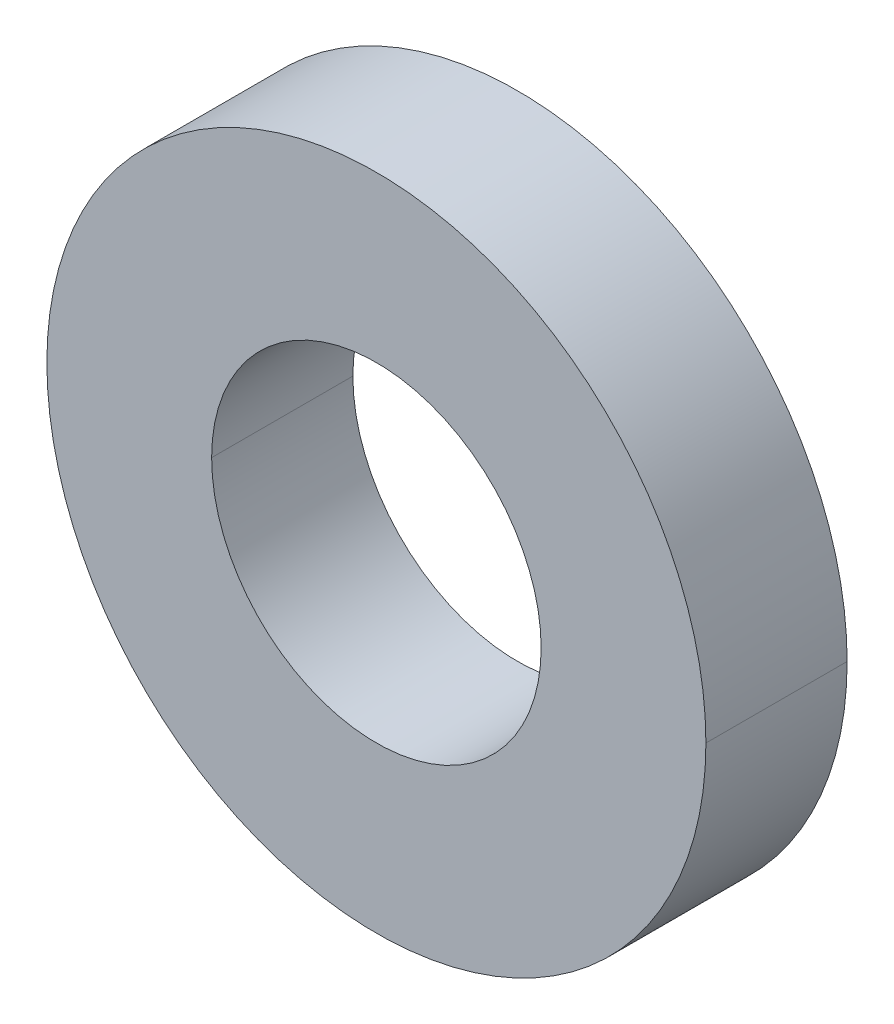
ISO-10303-21;
HEADER;
FILE_DESCRIPTION(('STEP AP214'),'2;1');
FILE_NAME('part.step','',(''),(''),'','','');
FILE_SCHEMA(('AUTOMOTIVE_DESIGN { 1 0 10303 214 1 1 1 1 }'));
ENDSEC;
DATA;
#1=APPLICATION_CONTEXT('core data for automotive mechanical design processes');
#2=APPLICATION_PROTOCOL_DEFINITION('international standard','automotive_design',2000,#1);
#3=PRODUCT_CONTEXT('',#1,'mechanical');
#4=PRODUCT('Part','Part','',(#3));
#5=PRODUCT_RELATED_PRODUCT_CATEGORY('part','',(#4));
#6=PRODUCT_DEFINITION_FORMATION('','',#4);
#7=PRODUCT_DEFINITION_CONTEXT('part definition',#1,'design');
#8=PRODUCT_DEFINITION('design','',#6,#7);
#9=PRODUCT_DEFINITION_SHAPE('','',#8);
#10=(LENGTH_UNIT() NAMED_UNIT(*) SI_UNIT(.MILLI.,.METRE.));
#11=(NAMED_UNIT(*) PLANE_ANGLE_UNIT() SI_UNIT($,.RADIAN.));
#12=(NAMED_UNIT(*) SI_UNIT($,.STERADIAN.) SOLID_ANGLE_UNIT());
#13=UNCERTAINTY_MEASURE_WITH_UNIT(LENGTH_MEASURE(1.E-05),#10,'distance_accuracy_value','');
#14=(GEOMETRIC_REPRESENTATION_CONTEXT(3) GLOBAL_UNCERTAINTY_ASSIGNED_CONTEXT((#13)) GLOBAL_UNIT_ASSIGNED_CONTEXT((#10,
#11,#12)) REPRESENTATION_CONTEXT('',''));
#15=CARTESIAN_POINT('',(0.,0.,0.));
#16=DIRECTION('',(0.,0.,1.));
#17=DIRECTION('',(1.,0.,0.));
#18=AXIS2_PLACEMENT_3D('',#15,#16,#17);
#19=CARTESIAN_POINT('',(0.,0.,0.));
#20=DIRECTION('',(0.,0.,1.));
#21=DIRECTION('',(1.,0.,0.));
#22=AXIS2_PLACEMENT_3D('',#19,#20,#21);
#23=PLANE('',#22);
#24=CARTESIAN_POINT('',(0.,0.,0.));
#25=DIRECTION('',(0.,0.,-1.));
#26=DIRECTION('',(-1.,0.,0.));
#27=AXIS2_PLACEMENT_3D('',#24,#25,#26);
#28=CIRCLE('',#27,3.5);
#29=CARTESIAN_POINT('',(3.5,0.,0.));
#30=VERTEX_POINT('',#29);
#31=CARTESIAN_POINT('',(-3.5,0.,0.));
#32=VERTEX_POINT('',#31);
#33=EDGE_CURVE('E82',#30,#32,#28,.F.);
#34=ORIENTED_EDGE('',*,*,#33,.T.);
#35=CARTESIAN_POINT('',(0.,0.,0.));
#36=DIRECTION('',(0.,0.,-1.));
#37=DIRECTION('',(-1.,0.,0.));
#38=AXIS2_PLACEMENT_3D('',#35,#36,#37);
#39=CIRCLE('',#38,3.5);
#40=EDGE_CURVE('E79',#32,#30,#39,.F.);
#41=ORIENTED_EDGE('',*,*,#40,.T.);
#42=EDGE_LOOP('',(#34,#41));
#43=FACE_BOUND('',#42,.T.);
#44=CARTESIAN_POINT('',(0.,0.,0.));
#45=DIRECTION('',(0.,0.,-1.));
#46=DIRECTION('',(-1.,0.,0.));
#47=AXIS2_PLACEMENT_3D('',#44,#45,#46);
#48=CIRCLE('',#47,7.);
#49=CARTESIAN_POINT('',(-7.,0.,0.));
#50=VERTEX_POINT('',#49);
#51=CARTESIAN_POINT('',(7.,0.,0.));
#52=VERTEX_POINT('',#51);
#53=EDGE_CURVE('E20',#50,#52,#48,.F.);
#54=ORIENTED_EDGE('',*,*,#53,.F.);
#55=CARTESIAN_POINT('',(0.,0.,0.));
#56=DIRECTION('',(0.,0.,-1.));
#57=DIRECTION('',(-1.,0.,0.));
#58=AXIS2_PLACEMENT_3D('',#55,#56,#57);
#59=CIRCLE('',#58,7.);
#60=EDGE_CURVE('E64',#52,#50,#59,.F.);
#61=ORIENTED_EDGE('',*,*,#60,.F.);
#62=EDGE_LOOP('',(#54,#61));
#63=FACE_BOUND('',#62,.T.);
#64=ADVANCED_FACE('F17',(#43,#63),#23,.F.);
#65=CARTESIAN_POINT('',(0.,0.,3.));
#66=DIRECTION('',(0.,0.,-1.));
#67=DIRECTION('',(-1.,0.,0.));
#68=AXIS2_PLACEMENT_3D('',#65,#66,#67);
#69=CYLINDRICAL_SURFACE('',#68,7.);
#70=DIRECTION('',(0.,0.,-1.));
#71=VECTOR('',#70,1.);
#72=CARTESIAN_POINT('',(7.,0.,3.));
#73=LINE('',#72,#71);
#74=CARTESIAN_POINT('',(7.,0.,3.));
#75=VERTEX_POINT('',#74);
#76=EDGE_CURVE('E59',#75,#52,#73,.T.);
#77=ORIENTED_EDGE('',*,*,#76,.F.);
#78=CARTESIAN_POINT('',(0.,0.,3.));
#79=DIRECTION('',(0.,0.,-1.));
#80=DIRECTION('',(-1.,0.,0.));
#81=AXIS2_PLACEMENT_3D('',#78,#79,#80);
#82=CIRCLE('',#81,7.);
#83=CARTESIAN_POINT('',(-7.,0.,3.));
#84=VERTEX_POINT('',#83);
#85=EDGE_CURVE('E77',#84,#75,#82,.F.);
#86=ORIENTED_EDGE('',*,*,#85,.F.);
#87=DIRECTION('',(0.,0.,-1.));
#88=VECTOR('',#87,1.);
#89=CARTESIAN_POINT('',(-7.,0.,3.));
#90=LINE('',#89,#88);
#91=EDGE_CURVE('E62',#50,#84,#90,.F.);
#92=ORIENTED_EDGE('',*,*,#91,.F.);
#93=ORIENTED_EDGE('',*,*,#53,.T.);
#94=EDGE_LOOP('',(#77,#86,#92,#93));
#95=FACE_BOUND('',#94,.T.);
#96=ADVANCED_FACE('F57',(#95),#69,.T.);
#97=CARTESIAN_POINT('',(0.,0.,3.));
#98=DIRECTION('',(0.,0.,-1.));
#99=DIRECTION('',(-1.,0.,0.));
#100=AXIS2_PLACEMENT_3D('',#97,#98,#99);
#101=CYLINDRICAL_SURFACE('',#100,7.);
#102=ORIENTED_EDGE('',*,*,#91,.T.);
#103=CARTESIAN_POINT('',(0.,0.,3.));
#104=DIRECTION('',(0.,0.,-1.));
#105=DIRECTION('',(-1.,0.,0.));
#106=AXIS2_PLACEMENT_3D('',#103,#104,#105);
#107=CIRCLE('',#106,7.);
#108=EDGE_CURVE('E68',#75,#84,#107,.F.);
#109=ORIENTED_EDGE('',*,*,#108,.F.);
#110=ORIENTED_EDGE('',*,*,#76,.T.);
#111=ORIENTED_EDGE('',*,*,#60,.T.);
#112=EDGE_LOOP('',(#102,#109,#110,#111));
#113=FACE_BOUND('',#112,.T.);
#114=ADVANCED_FACE('F66',(#113),#101,.T.);
#115=CARTESIAN_POINT('',(0.,0.,3.));
#116=DIRECTION('',(0.,0.,-1.));
#117=DIRECTION('',(-1.,0.,0.));
#118=AXIS2_PLACEMENT_3D('',#115,#116,#117);
#119=CYLINDRICAL_SURFACE('',#118,3.5);
#120=ORIENTED_EDGE('',*,*,#33,.F.);
#121=DIRECTION('',(0.,0.,-1.));
#122=VECTOR('',#121,1.);
#123=CARTESIAN_POINT('',(3.5,0.,3.));
#124=LINE('',#123,#122);
#125=CARTESIAN_POINT('',(3.5,0.,3.));
#126=VERTEX_POINT('',#125);
#127=EDGE_CURVE('E35',#30,#126,#124,.F.);
#128=ORIENTED_EDGE('',*,*,#127,.T.);
#129=CARTESIAN_POINT('',(0.,0.,3.));
#130=DIRECTION('',(0.,0.,-1.));
#131=DIRECTION('',(-1.,0.,0.));
#132=AXIS2_PLACEMENT_3D('',#129,#130,#131);
#133=CIRCLE('',#132,3.5);
#134=CARTESIAN_POINT('',(-3.5,0.,3.));
#135=VERTEX_POINT('',#134);
#136=EDGE_CURVE('E26',#135,#126,#133,.T.);
#137=ORIENTED_EDGE('',*,*,#136,.F.);
#138=DIRECTION('',(0.,0.,-1.));
#139=VECTOR('',#138,1.);
#140=CARTESIAN_POINT('',(-3.5,0.,3.));
#141=LINE('',#140,#139);
#142=EDGE_CURVE('E81',#135,#32,#141,.T.);
#143=ORIENTED_EDGE('',*,*,#142,.T.);
#144=EDGE_LOOP('',(#120,#128,#137,#143));
#145=FACE_BOUND('',#144,.T.);
#146=ADVANCED_FACE('F95',(#145),#119,.F.);
#147=CARTESIAN_POINT('',(0.,0.,3.));
#148=DIRECTION('',(0.,0.,-1.));
#149=DIRECTION('',(-1.,0.,0.));
#150=AXIS2_PLACEMENT_3D('',#147,#148,#149);
#151=CYLINDRICAL_SURFACE('',#150,3.5);
#152=ORIENTED_EDGE('',*,*,#40,.F.);
#153=ORIENTED_EDGE('',*,*,#142,.F.);
#154=CARTESIAN_POINT('',(0.,0.,3.));
#155=DIRECTION('',(0.,0.,-1.));
#156=DIRECTION('',(-1.,0.,0.));
#157=AXIS2_PLACEMENT_3D('',#154,#155,#156);
#158=CIRCLE('',#157,3.5);
#159=EDGE_CURVE('E11',#126,#135,#158,.T.);
#160=ORIENTED_EDGE('',*,*,#159,.F.);
#161=ORIENTED_EDGE('',*,*,#127,.F.);
#162=EDGE_LOOP('',(#152,#153,#160,#161));
#163=FACE_BOUND('',#162,.T.);
#164=ADVANCED_FACE('F88',(#163),#151,.F.);
#165=CARTESIAN_POINT('',(0.,0.,3.));
#166=DIRECTION('',(0.,0.,1.));
#167=DIRECTION('',(1.,0.,0.));
#168=AXIS2_PLACEMENT_3D('',#165,#166,#167);
#169=PLANE('',#168);
#170=ORIENTED_EDGE('',*,*,#136,.T.);
#171=ORIENTED_EDGE('',*,*,#159,.T.);
#172=EDGE_LOOP('',(#170,#171));
#173=FACE_BOUND('',#172,.T.);
#174=ORIENTED_EDGE('',*,*,#85,.T.);
#175=ORIENTED_EDGE('',*,*,#108,.T.);
#176=EDGE_LOOP('',(#174,#175));
#177=FACE_BOUND('',#176,.T.);
#178=ADVANCED_FACE('F86',(#173,#177),#169,.T.);
#179=CLOSED_SHELL('',(#64,#96,#114,#146,#164,#178));
#180=MANIFOLD_SOLID_BREP('B1',#179);
#181=ADVANCED_BREP_SHAPE_REPRESENTATION('',(#18,#180),#14);
#182=SHAPE_DEFINITION_REPRESENTATION(#9,#181);
ENDSEC;
END-ISO-10303-21;
